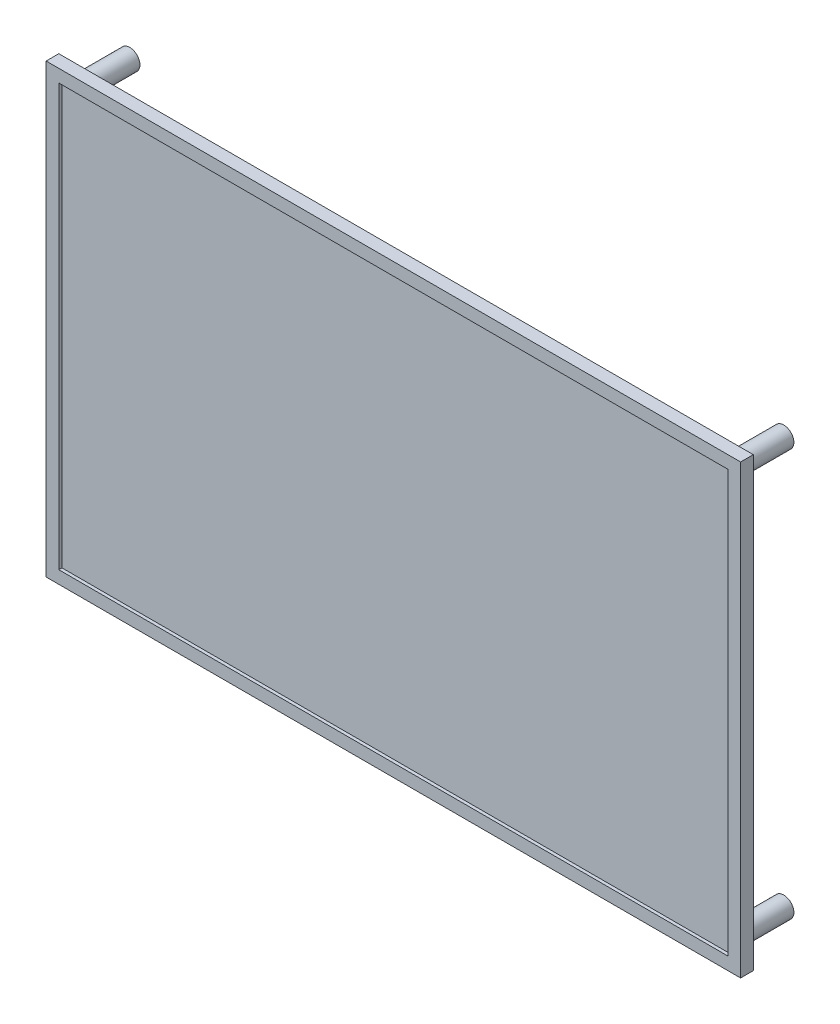
ISO-10303-21;
HEADER;
FILE_DESCRIPTION(('STEP AP214'),'2;1');
FILE_NAME('part.step','',(''),(''),'','','');
FILE_SCHEMA(('AUTOMOTIVE_DESIGN { 1 0 10303 214 1 1 1 1 }'));
ENDSEC;
DATA;
#1=APPLICATION_CONTEXT('core data for automotive mechanical design processes');
#2=APPLICATION_PROTOCOL_DEFINITION('international standard','automotive_design',2000,#1);
#3=PRODUCT_CONTEXT('',#1,'mechanical');
#4=PRODUCT('Part','Part','',(#3));
#5=PRODUCT_RELATED_PRODUCT_CATEGORY('part','',(#4));
#6=PRODUCT_DEFINITION_FORMATION('','',#4);
#7=PRODUCT_DEFINITION_CONTEXT('part definition',#1,'design');
#8=PRODUCT_DEFINITION('design','',#6,#7);
#9=PRODUCT_DEFINITION_SHAPE('','',#8);
#10=(LENGTH_UNIT() NAMED_UNIT(*) SI_UNIT(.MILLI.,.METRE.));
#11=(NAMED_UNIT(*) PLANE_ANGLE_UNIT() SI_UNIT($,.RADIAN.));
#12=(NAMED_UNIT(*) SI_UNIT($,.STERADIAN.) SOLID_ANGLE_UNIT());
#13=UNCERTAINTY_MEASURE_WITH_UNIT(LENGTH_MEASURE(1.E-05),#10,'distance_accuracy_value','');
#14=(GEOMETRIC_REPRESENTATION_CONTEXT(3) GLOBAL_UNCERTAINTY_ASSIGNED_CONTEXT((#13)) GLOBAL_UNIT_ASSIGNED_CONTEXT((#10,
#11,#12)) REPRESENTATION_CONTEXT('',''));
#15=CARTESIAN_POINT('',(0.,0.,0.));
#16=DIRECTION('',(0.,0.,1.));
#17=DIRECTION('',(1.,0.,0.));
#18=AXIS2_PLACEMENT_3D('',#15,#16,#17);
#19=CARTESIAN_POINT('',(320.970675525994,77.6506981907003,8.00000000000002));
#20=DIRECTION('',(0.,0.,-1.));
#21=DIRECTION('',(-1.,0.,0.));
#22=AXIS2_PLACEMENT_3D('',#19,#20,#21);
#23=CYLINDRICAL_SURFACE('',#22,1.60000000000002);
#24=CARTESIAN_POINT('',(320.970675525994,77.6506981907003,8.00000000000002));
#25=DIRECTION('',(0.,0.,1.));
#26=DIRECTION('',(1.,0.,0.));
#27=AXIS2_PLACEMENT_3D('',#24,#25,#26);
#28=CIRCLE('',#27,1.60000000000002);
#29=CARTESIAN_POINT('',(322.570675525994,77.6506981907003,8.00000000000002));
#30=VERTEX_POINT('',#29);
#31=EDGE_CURVE('E11',#30,#30,#28,.T.);
#32=ORIENTED_EDGE('',*,*,#31,.F.);
#33=EDGE_LOOP('',(#32));
#34=FACE_BOUND('',#33,.T.);
#35=CARTESIAN_POINT('',(320.970675525994,77.6506981907003,0.));
#36=DIRECTION('',(0.,0.,1.));
#37=DIRECTION('',(1.,0.,0.));
#38=AXIS2_PLACEMENT_3D('',#35,#36,#37);
#39=CIRCLE('',#38,1.60000000000002);
#40=CARTESIAN_POINT('',(322.570675525994,77.6506981907003,0.));
#41=VERTEX_POINT('',#40);
#42=EDGE_CURVE('E42',#41,#41,#39,.T.);
#43=ORIENTED_EDGE('',*,*,#42,.T.);
#44=EDGE_LOOP('',(#43));
#45=FACE_BOUND('',#44,.T.);
#46=ADVANCED_FACE('F39',(#34,#45),#23,.T.);
#47=CARTESIAN_POINT('',(320.970675525994,77.6506981907003,0.));
#48=DIRECTION('',(0.,0.,1.));
#49=DIRECTION('',(1.,0.,0.));
#50=AXIS2_PLACEMENT_3D('',#47,#48,#49);
#51=PLANE('',#50);
#52=ORIENTED_EDGE('',*,*,#42,.F.);
#53=EDGE_LOOP('',(#52));
#54=FACE_BOUND('',#53,.T.);
#55=ADVANCED_FACE('F196',(#54),#51,.F.);
#56=CARTESIAN_POINT('',(214.620413800696,80.7916650300905,10.));
#57=DIRECTION('',(1.,0.,0.));
#58=DIRECTION('',(0.,0.,-1.));
#59=AXIS2_PLACEMENT_3D('',#56,#57,#58);
#60=PLANE('',#59);
#61=DIRECTION('',(0.,-1.,0.));
#62=VECTOR('',#61,1.);
#63=CARTESIAN_POINT('',(214.620413800696,80.7916650300905,8.00000000000002));
#64=LINE('',#63,#62);
#65=CARTESIAN_POINT('',(214.620413800696,80.7916650300905,8.00000000000002));
#66=VERTEX_POINT('',#65);
#67=CARTESIAN_POINT('',(214.620413800696,10.2999321072884,8.00000000000002));
#68=VERTEX_POINT('',#67);
#69=EDGE_CURVE('E167',#66,#68,#64,.T.);
#70=ORIENTED_EDGE('',*,*,#69,.T.);
#71=DIRECTION('',(0.,0.,-1.));
#72=VECTOR('',#71,1.);
#73=CARTESIAN_POINT('',(214.620413800696,10.2999321072884,10.));
#74=LINE('',#73,#72);
#75=CARTESIAN_POINT('',(214.620413800696,10.2999321072884,10.));
#76=VERTEX_POINT('',#75);
#77=EDGE_CURVE('E190',#76,#68,#74,.T.);
#78=ORIENTED_EDGE('',*,*,#77,.F.);
#79=DIRECTION('',(0.,-1.,0.));
#80=VECTOR('',#79,1.);
#81=CARTESIAN_POINT('',(214.620413800696,80.7916650300905,10.));
#82=LINE('',#81,#80);
#83=CARTESIAN_POINT('',(214.620413800696,80.7916650300905,10.));
#84=VERTEX_POINT('',#83);
#85=EDGE_CURVE('E170',#84,#76,#82,.T.);
#86=ORIENTED_EDGE('',*,*,#85,.F.);
#87=DIRECTION('',(0.,0.,-1.));
#88=VECTOR('',#87,1.);
#89=CARTESIAN_POINT('',(214.620413800696,80.7916650300905,10.));
#90=LINE('',#89,#88);
#91=EDGE_CURVE('E176',#84,#66,#90,.T.);
#92=ORIENTED_EDGE('',*,*,#91,.T.);
#93=EDGE_LOOP('',(#70,#78,#86,#92));
#94=FACE_BOUND('',#93,.T.);
#95=ADVANCED_FACE('F198',(#94),#60,.F.);
#96=CARTESIAN_POINT('',(324.16733855386,10.2999321072884,10.));
#97=DIRECTION('',(0.,1.,0.));
#98=DIRECTION('',(0.,0.,1.));
#99=AXIS2_PLACEMENT_3D('',#96,#97,#98);
#100=PLANE('',#99);
#101=DIRECTION('',(1.,0.,0.));
#102=VECTOR('',#101,1.);
#103=CARTESIAN_POINT('',(324.16733855386,10.2999321072884,8.00000000000002));
#104=LINE('',#103,#102);
#105=CARTESIAN_POINT('',(324.16733855386,10.2999321072884,8.00000000000002));
#106=VERTEX_POINT('',#105);
#107=EDGE_CURVE('E179',#68,#106,#104,.T.);
#108=ORIENTED_EDGE('',*,*,#107,.T.);
#109=DIRECTION('',(0.,0.,-1.));
#110=VECTOR('',#109,1.);
#111=CARTESIAN_POINT('',(324.16733855386,10.2999321072884,10.));
#112=LINE('',#111,#110);
#113=CARTESIAN_POINT('',(324.16733855386,10.2999321072884,10.));
#114=VERTEX_POINT('',#113);
#115=EDGE_CURVE('E187',#114,#106,#112,.T.);
#116=ORIENTED_EDGE('',*,*,#115,.F.);
#117=DIRECTION('',(1.,0.,0.));
#118=VECTOR('',#117,1.);
#119=CARTESIAN_POINT('',(324.16733855386,10.2999321072884,10.));
#120=LINE('',#119,#118);
#121=EDGE_CURVE('E91',#76,#114,#120,.T.);
#122=ORIENTED_EDGE('',*,*,#121,.F.);
#123=ORIENTED_EDGE('',*,*,#77,.T.);
#124=EDGE_LOOP('',(#108,#116,#122,#123));
#125=FACE_BOUND('',#124,.T.);
#126=ADVANCED_FACE('F203',(#125),#100,.F.);
#127=CARTESIAN_POINT('',(324.16733855386,80.7916650300905,10.));
#128=DIRECTION('',(-1.,0.,0.));
#129=DIRECTION('',(0.,0.,1.));
#130=AXIS2_PLACEMENT_3D('',#127,#128,#129);
#131=PLANE('',#130);
#132=DIRECTION('',(0.,1.,0.));
#133=VECTOR('',#132,1.);
#134=CARTESIAN_POINT('',(324.16733855386,80.7916650300905,8.00000000000002));
#135=LINE('',#134,#133);
#136=CARTESIAN_POINT('',(324.16733855386,80.7916650300905,8.00000000000002));
#137=VERTEX_POINT('',#136);
#138=EDGE_CURVE('E181',#106,#137,#135,.T.);
#139=ORIENTED_EDGE('',*,*,#138,.T.);
#140=DIRECTION('',(0.,0.,-1.));
#141=VECTOR('',#140,1.);
#142=CARTESIAN_POINT('',(324.16733855386,80.7916650300905,10.));
#143=LINE('',#142,#141);
#144=CARTESIAN_POINT('',(324.16733855386,80.7916650300905,10.));
#145=VERTEX_POINT('',#144);
#146=EDGE_CURVE('E185',#145,#137,#143,.T.);
#147=ORIENTED_EDGE('',*,*,#146,.F.);
#148=DIRECTION('',(0.,1.,0.));
#149=VECTOR('',#148,1.);
#150=CARTESIAN_POINT('',(324.16733855386,80.7916650300905,10.));
#151=LINE('',#150,#149);
#152=EDGE_CURVE('E173',#114,#145,#151,.T.);
#153=ORIENTED_EDGE('',*,*,#152,.F.);
#154=ORIENTED_EDGE('',*,*,#115,.T.);
#155=EDGE_LOOP('',(#139,#147,#153,#154));
#156=FACE_BOUND('',#155,.T.);
#157=ADVANCED_FACE('F210',(#156),#131,.F.);
#158=CARTESIAN_POINT('',(324.16733855386,80.7916650300905,10.));
#159=DIRECTION('',(0.,-1.,0.));
#160=DIRECTION('',(0.,0.,-1.));
#161=AXIS2_PLACEMENT_3D('',#158,#159,#160);
#162=PLANE('',#161);
#163=DIRECTION('',(-1.,0.,0.));
#164=VECTOR('',#163,1.);
#165=CARTESIAN_POINT('',(324.16733855386,80.7916650300905,8.00000000000002));
#166=LINE('',#165,#164);
#167=EDGE_CURVE('E83',#137,#66,#166,.T.);
#168=ORIENTED_EDGE('',*,*,#167,.T.);
#169=ORIENTED_EDGE('',*,*,#91,.F.);
#170=DIRECTION('',(-1.,0.,0.));
#171=VECTOR('',#170,1.);
#172=CARTESIAN_POINT('',(324.16733855386,80.7916650300905,10.));
#173=LINE('',#172,#171);
#174=EDGE_CURVE('E62',#145,#84,#173,.T.);
#175=ORIENTED_EDGE('',*,*,#174,.F.);
#176=ORIENTED_EDGE('',*,*,#146,.T.);
#177=EDGE_LOOP('',(#168,#169,#175,#176));
#178=FACE_BOUND('',#177,.T.);
#179=ADVANCED_FACE('F213',(#178),#162,.F.);
#180=CARTESIAN_POINT('',(0.,0.,10.));
#181=DIRECTION('',(0.,0.,-1.));
#182=DIRECTION('',(-1.,0.,0.));
#183=AXIS2_PLACEMENT_3D('',#180,#181,#182);
#184=PLANE('',#183);
#185=DIRECTION('',(0.,-1.,0.));
#186=VECTOR('',#185,1.);
#187=CARTESIAN_POINT('',(216.620413800696,78.7916650300905,10.));
#188=LINE('',#187,#186);
#189=CARTESIAN_POINT('',(216.620413800696,78.7916650300905,10.));
#190=VERTEX_POINT('',#189);
#191=CARTESIAN_POINT('',(216.620413800696,12.2999321072884,10.));
#192=VERTEX_POINT('',#191);
#193=EDGE_CURVE('E142',#190,#192,#188,.T.);
#194=ORIENTED_EDGE('',*,*,#193,.F.);
#195=DIRECTION('',(-1.,0.,0.));
#196=VECTOR('',#195,1.);
#197=CARTESIAN_POINT('',(322.16733855386,78.7916650300905,10.));
#198=LINE('',#197,#196);
#199=CARTESIAN_POINT('',(322.16733855386,78.7916650300905,10.));
#200=VERTEX_POINT('',#199);
#201=EDGE_CURVE('E53',#200,#190,#198,.T.);
#202=ORIENTED_EDGE('',*,*,#201,.F.);
#203=DIRECTION('',(0.,1.,0.));
#204=VECTOR('',#203,1.);
#205=CARTESIAN_POINT('',(322.16733855386,12.2999321072884,10.));
#206=LINE('',#205,#204);
#207=CARTESIAN_POINT('',(322.16733855386,12.2999321072884,10.));
#208=VERTEX_POINT('',#207);
#209=EDGE_CURVE('E133',#208,#200,#206,.T.);
#210=ORIENTED_EDGE('',*,*,#209,.F.);
#211=DIRECTION('',(1.,0.,0.));
#212=VECTOR('',#211,1.);
#213=CARTESIAN_POINT('',(216.620413800696,12.2999321072884,10.));
#214=LINE('',#213,#212);
#215=EDGE_CURVE('E136',#192,#208,#214,.T.);
#216=ORIENTED_EDGE('',*,*,#215,.F.);
#217=EDGE_LOOP('',(#194,#202,#210,#216));
#218=FACE_BOUND('',#217,.T.);
#219=ORIENTED_EDGE('',*,*,#85,.T.);
#220=ORIENTED_EDGE('',*,*,#121,.T.);
#221=ORIENTED_EDGE('',*,*,#152,.T.);
#222=ORIENTED_EDGE('',*,*,#174,.T.);
#223=EDGE_LOOP('',(#219,#220,#221,#222));
#224=FACE_BOUND('',#223,.T.);
#225=ADVANCED_FACE('F217',(#218,#224),#184,.F.);
#226=CARTESIAN_POINT('',(0.,0.,8.00000000000002));
#227=DIRECTION('',(0.,0.,-1.));
#228=DIRECTION('',(-1.,0.,0.));
#229=AXIS2_PLACEMENT_3D('',#226,#227,#228);
#230=PLANE('',#229);
#231=CARTESIAN_POINT('',(217.817076828562,77.6506981907003,8.00000000000002));
#232=DIRECTION('',(0.,0.,1.));
#233=DIRECTION('',(-1.,0.,0.));
#234=AXIS2_PLACEMENT_3D('',#231,#232,#233);
#235=CIRCLE('',#234,1.60000000000002);
#236=CARTESIAN_POINT('',(216.217076828562,77.6506981907003,8.00000000000002));
#237=VERTEX_POINT('',#236);
#238=EDGE_CURVE('E148',#237,#237,#235,.T.);
#239=ORIENTED_EDGE('',*,*,#238,.T.);
#240=EDGE_LOOP('',(#239));
#241=FACE_BOUND('',#240,.T.);
#242=CARTESIAN_POINT('',(217.817076828562,13.4408989466785,8.00000000000002));
#243=DIRECTION('',(0.,0.,1.));
#244=DIRECTION('',(1.,0.,0.));
#245=AXIS2_PLACEMENT_3D('',#242,#243,#244);
#246=CIRCLE('',#245,1.60000000000002);
#247=CARTESIAN_POINT('',(219.417076828562,13.4408989466785,8.00000000000002));
#248=VERTEX_POINT('',#247);
#249=EDGE_CURVE('E155',#248,#248,#246,.T.);
#250=ORIENTED_EDGE('',*,*,#249,.T.);
#251=EDGE_LOOP('',(#250));
#252=FACE_BOUND('',#251,.T.);
#253=CARTESIAN_POINT('',(320.970675525994,13.4408989466785,8.00000000000002));
#254=DIRECTION('',(0.,0.,1.));
#255=DIRECTION('',(-1.,0.,0.));
#256=AXIS2_PLACEMENT_3D('',#253,#254,#255);
#257=CIRCLE('',#256,1.60000000000002);
#258=CARTESIAN_POINT('',(319.370675525994,13.4408989466785,8.00000000000002));
#259=VERTEX_POINT('',#258);
#260=EDGE_CURVE('E161',#259,#259,#257,.T.);
#261=ORIENTED_EDGE('',*,*,#260,.T.);
#262=EDGE_LOOP('',(#261));
#263=FACE_BOUND('',#262,.T.);
#264=ORIENTED_EDGE('',*,*,#31,.T.);
#265=EDGE_LOOP('',(#264));
#266=FACE_BOUND('',#265,.T.);
#267=ORIENTED_EDGE('',*,*,#69,.F.);
#268=ORIENTED_EDGE('',*,*,#167,.F.);
#269=ORIENTED_EDGE('',*,*,#138,.F.);
#270=ORIENTED_EDGE('',*,*,#107,.F.);
#271=EDGE_LOOP('',(#267,#268,#269,#270));
#272=FACE_BOUND('',#271,.T.);
#273=ADVANCED_FACE('F218',(#241,#252,#263,#266,#272),#230,.T.);
#274=CARTESIAN_POINT('',(320.970675525994,13.4408989466785,8.00000000000002));
#275=DIRECTION('',(0.,0.,-1.));
#276=DIRECTION('',(-1.,0.,0.));
#277=AXIS2_PLACEMENT_3D('',#274,#275,#276);
#278=CYLINDRICAL_SURFACE('',#277,1.60000000000002);
#279=ORIENTED_EDGE('',*,*,#260,.F.);
#280=EDGE_LOOP('',(#279));
#281=FACE_BOUND('',#280,.T.);
#282=CARTESIAN_POINT('',(320.970675525994,13.4408989466785,0.));
#283=DIRECTION('',(0.,0.,1.));
#284=DIRECTION('',(-1.,0.,0.));
#285=AXIS2_PLACEMENT_3D('',#282,#283,#284);
#286=CIRCLE('',#285,1.60000000000002);
#287=CARTESIAN_POINT('',(319.370675525994,13.4408989466785,0.));
#288=VERTEX_POINT('',#287);
#289=EDGE_CURVE('E164',#288,#288,#286,.T.);
#290=ORIENTED_EDGE('',*,*,#289,.T.);
#291=EDGE_LOOP('',(#290));
#292=FACE_BOUND('',#291,.T.);
#293=ADVANCED_FACE('F221',(#281,#292),#278,.T.);
#294=CARTESIAN_POINT('',(320.970675525994,13.4408989466785,0.));
#295=DIRECTION('',(0.,0.,-1.));
#296=DIRECTION('',(-1.,0.,0.));
#297=AXIS2_PLACEMENT_3D('',#294,#295,#296);
#298=PLANE('',#297);
#299=ORIENTED_EDGE('',*,*,#289,.F.);
#300=EDGE_LOOP('',(#299));
#301=FACE_BOUND('',#300,.T.);
#302=ADVANCED_FACE('F226',(#301),#298,.T.);
#303=CARTESIAN_POINT('',(217.817076828562,13.4408989466785,8.00000000000002));
#304=DIRECTION('',(0.,0.,-1.));
#305=DIRECTION('',(-1.,0.,0.));
#306=AXIS2_PLACEMENT_3D('',#303,#304,#305);
#307=CYLINDRICAL_SURFACE('',#306,1.60000000000002);
#308=ORIENTED_EDGE('',*,*,#249,.F.);
#309=EDGE_LOOP('',(#308));
#310=FACE_BOUND('',#309,.T.);
#311=CARTESIAN_POINT('',(217.817076828562,13.4408989466785,0.));
#312=DIRECTION('',(0.,0.,1.));
#313=DIRECTION('',(1.,0.,0.));
#314=AXIS2_PLACEMENT_3D('',#311,#312,#313);
#315=CIRCLE('',#314,1.60000000000002);
#316=CARTESIAN_POINT('',(219.417076828562,13.4408989466785,0.));
#317=VERTEX_POINT('',#316);
#318=EDGE_CURVE('E158',#317,#317,#315,.T.);
#319=ORIENTED_EDGE('',*,*,#318,.T.);
#320=EDGE_LOOP('',(#319));
#321=FACE_BOUND('',#320,.T.);
#322=ADVANCED_FACE('F229',(#310,#321),#307,.T.);
#323=CARTESIAN_POINT('',(217.817076828562,13.4408989466785,0.));
#324=DIRECTION('',(0.,0.,1.));
#325=DIRECTION('',(1.,0.,0.));
#326=AXIS2_PLACEMENT_3D('',#323,#324,#325);
#327=PLANE('',#326);
#328=ORIENTED_EDGE('',*,*,#318,.F.);
#329=EDGE_LOOP('',(#328));
#330=FACE_BOUND('',#329,.T.);
#331=ADVANCED_FACE('F234',(#330),#327,.F.);
#332=CARTESIAN_POINT('',(217.817076828562,77.6506981907003,8.00000000000002));
#333=DIRECTION('',(0.,0.,-1.));
#334=DIRECTION('',(-1.,0.,0.));
#335=AXIS2_PLACEMENT_3D('',#332,#333,#334);
#336=CYLINDRICAL_SURFACE('',#335,1.60000000000002);
#337=ORIENTED_EDGE('',*,*,#238,.F.);
#338=EDGE_LOOP('',(#337));
#339=FACE_BOUND('',#338,.T.);
#340=CARTESIAN_POINT('',(217.817076828562,77.6506981907003,0.));
#341=DIRECTION('',(0.,0.,1.));
#342=DIRECTION('',(-1.,0.,0.));
#343=AXIS2_PLACEMENT_3D('',#340,#341,#342);
#344=CIRCLE('',#343,1.60000000000002);
#345=CARTESIAN_POINT('',(216.217076828562,77.6506981907003,0.));
#346=VERTEX_POINT('',#345);
#347=EDGE_CURVE('E152',#346,#346,#344,.T.);
#348=ORIENTED_EDGE('',*,*,#347,.T.);
#349=EDGE_LOOP('',(#348));
#350=FACE_BOUND('',#349,.T.);
#351=ADVANCED_FACE('F237',(#339,#350),#336,.T.);
#352=CARTESIAN_POINT('',(217.817076828562,77.6506981907003,0.));
#353=DIRECTION('',(0.,0.,-1.));
#354=DIRECTION('',(-1.,0.,0.));
#355=AXIS2_PLACEMENT_3D('',#352,#353,#354);
#356=PLANE('',#355);
#357=ORIENTED_EDGE('',*,*,#347,.F.);
#358=EDGE_LOOP('',(#357));
#359=FACE_BOUND('',#358,.T.);
#360=ADVANCED_FACE('F242',(#359),#356,.T.);
#361=CARTESIAN_POINT('',(322.16733855386,78.7916650300905,9.50000000000002));
#362=DIRECTION('',(0.,1.,0.));
#363=DIRECTION('',(0.,0.,1.));
#364=AXIS2_PLACEMENT_3D('',#361,#362,#363);
#365=PLANE('',#364);
#366=ORIENTED_EDGE('',*,*,#201,.T.);
#367=DIRECTION('',(0.,0.,1.));
#368=VECTOR('',#367,1.);
#369=CARTESIAN_POINT('',(216.620413800696,78.7916650300905,9.50000000000002));
#370=LINE('',#369,#368);
#371=CARTESIAN_POINT('',(216.620413800696,78.7916650300905,9.50000000000002));
#372=VERTEX_POINT('',#371);
#373=EDGE_CURVE('E111',#372,#190,#370,.T.);
#374=ORIENTED_EDGE('',*,*,#373,.F.);
#375=DIRECTION('',(-1.,0.,0.));
#376=VECTOR('',#375,1.);
#377=CARTESIAN_POINT('',(322.16733855386,78.7916650300905,9.50000000000002));
#378=LINE('',#377,#376);
#379=CARTESIAN_POINT('',(322.16733855386,78.7916650300905,9.50000000000002));
#380=VERTEX_POINT('',#379);
#381=EDGE_CURVE('E115',#380,#372,#378,.T.);
#382=ORIENTED_EDGE('',*,*,#381,.F.);
#383=DIRECTION('',(0.,0.,1.));
#384=VECTOR('',#383,1.);
#385=CARTESIAN_POINT('',(322.16733855386,78.7916650300905,9.50000000000002));
#386=LINE('',#385,#384);
#387=EDGE_CURVE('E146',#380,#200,#386,.T.);
#388=ORIENTED_EDGE('',*,*,#387,.T.);
#389=EDGE_LOOP('',(#366,#374,#382,#388));
#390=FACE_BOUND('',#389,.T.);
#391=ADVANCED_FACE('F113',(#390),#365,.F.);
#392=CARTESIAN_POINT('',(322.16733855386,12.2999321072884,9.50000000000002));
#393=DIRECTION('',(1.,0.,0.));
#394=DIRECTION('',(0.,0.,-1.));
#395=AXIS2_PLACEMENT_3D('',#392,#393,#394);
#396=PLANE('',#395);
#397=ORIENTED_EDGE('',*,*,#209,.T.);
#398=ORIENTED_EDGE('',*,*,#387,.F.);
#399=DIRECTION('',(0.,1.,0.));
#400=VECTOR('',#399,1.);
#401=CARTESIAN_POINT('',(322.16733855386,12.2999321072884,9.50000000000002));
#402=LINE('',#401,#400);
#403=CARTESIAN_POINT('',(322.16733855386,12.2999321072884,9.50000000000002));
#404=VERTEX_POINT('',#403);
#405=EDGE_CURVE('E121',#404,#380,#402,.T.);
#406=ORIENTED_EDGE('',*,*,#405,.F.);
#407=DIRECTION('',(0.,0.,1.));
#408=VECTOR('',#407,1.);
#409=CARTESIAN_POINT('',(322.16733855386,12.2999321072884,9.50000000000002));
#410=LINE('',#409,#408);
#411=EDGE_CURVE('E149',#404,#208,#410,.T.);
#412=ORIENTED_EDGE('',*,*,#411,.T.);
#413=EDGE_LOOP('',(#397,#398,#406,#412));
#414=FACE_BOUND('',#413,.T.);
#415=ADVANCED_FACE('F251',(#414),#396,.F.);
#416=CARTESIAN_POINT('',(216.620413800696,12.2999321072884,9.50000000000002));
#417=DIRECTION('',(0.,-1.,0.));
#418=DIRECTION('',(0.,0.,-1.));
#419=AXIS2_PLACEMENT_3D('',#416,#417,#418);
#420=PLANE('',#419);
#421=ORIENTED_EDGE('',*,*,#215,.T.);
#422=ORIENTED_EDGE('',*,*,#411,.F.);
#423=DIRECTION('',(1.,0.,0.));
#424=VECTOR('',#423,1.);
#425=CARTESIAN_POINT('',(216.620413800696,12.2999321072884,9.50000000000002));
#426=LINE('',#425,#424);
#427=CARTESIAN_POINT('',(216.620413800696,12.2999321072884,9.50000000000002));
#428=VERTEX_POINT('',#427);
#429=EDGE_CURVE('E129',#428,#404,#426,.T.);
#430=ORIENTED_EDGE('',*,*,#429,.F.);
#431=DIRECTION('',(0.,0.,1.));
#432=VECTOR('',#431,1.);
#433=CARTESIAN_POINT('',(216.620413800696,12.2999321072884,9.50000000000002));
#434=LINE('',#433,#432);
#435=EDGE_CURVE('E120',#428,#192,#434,.T.);
#436=ORIENTED_EDGE('',*,*,#435,.T.);
#437=EDGE_LOOP('',(#421,#422,#430,#436));
#438=FACE_BOUND('',#437,.T.);
#439=ADVANCED_FACE('F254',(#438),#420,.F.);
#440=CARTESIAN_POINT('',(216.620413800696,78.7916650300905,9.50000000000002));
#441=DIRECTION('',(-1.,0.,0.));
#442=DIRECTION('',(0.,0.,1.));
#443=AXIS2_PLACEMENT_3D('',#440,#441,#442);
#444=PLANE('',#443);
#445=ORIENTED_EDGE('',*,*,#193,.T.);
#446=ORIENTED_EDGE('',*,*,#435,.F.);
#447=DIRECTION('',(0.,-1.,0.));
#448=VECTOR('',#447,1.);
#449=CARTESIAN_POINT('',(216.620413800696,78.7916650300905,9.50000000000002));
#450=LINE('',#449,#448);
#451=EDGE_CURVE('E124',#372,#428,#450,.T.);
#452=ORIENTED_EDGE('',*,*,#451,.F.);
#453=ORIENTED_EDGE('',*,*,#373,.T.);
#454=EDGE_LOOP('',(#445,#446,#452,#453));
#455=FACE_BOUND('',#454,.T.);
#456=ADVANCED_FACE('F125',(#455),#444,.F.);
#457=CARTESIAN_POINT('',(0.,0.,9.50000000000002));
#458=DIRECTION('',(0.,0.,1.));
#459=DIRECTION('',(1.,0.,0.));
#460=AXIS2_PLACEMENT_3D('',#457,#458,#459);
#461=PLANE('',#460);
#462=ORIENTED_EDGE('',*,*,#381,.T.);
#463=ORIENTED_EDGE('',*,*,#451,.T.);
#464=ORIENTED_EDGE('',*,*,#429,.T.);
#465=ORIENTED_EDGE('',*,*,#405,.T.);
#466=EDGE_LOOP('',(#462,#463,#464,#465));
#467=FACE_BOUND('',#466,.T.);
#468=ADVANCED_FACE('F131',(#467),#461,.T.);
#469=CLOSED_SHELL('',(#46,#55,#95,#126,#157,#179,#225,#273,#293,#302,#322,#331,#351,#360,#391,
#415,#439,#456,#468));
#470=MANIFOLD_SOLID_BREP('B2',#469);
#471=ADVANCED_BREP_SHAPE_REPRESENTATION('',(#18,#470),#14);
#472=SHAPE_DEFINITION_REPRESENTATION(#9,#471);
ENDSEC;
END-ISO-10303-21;
